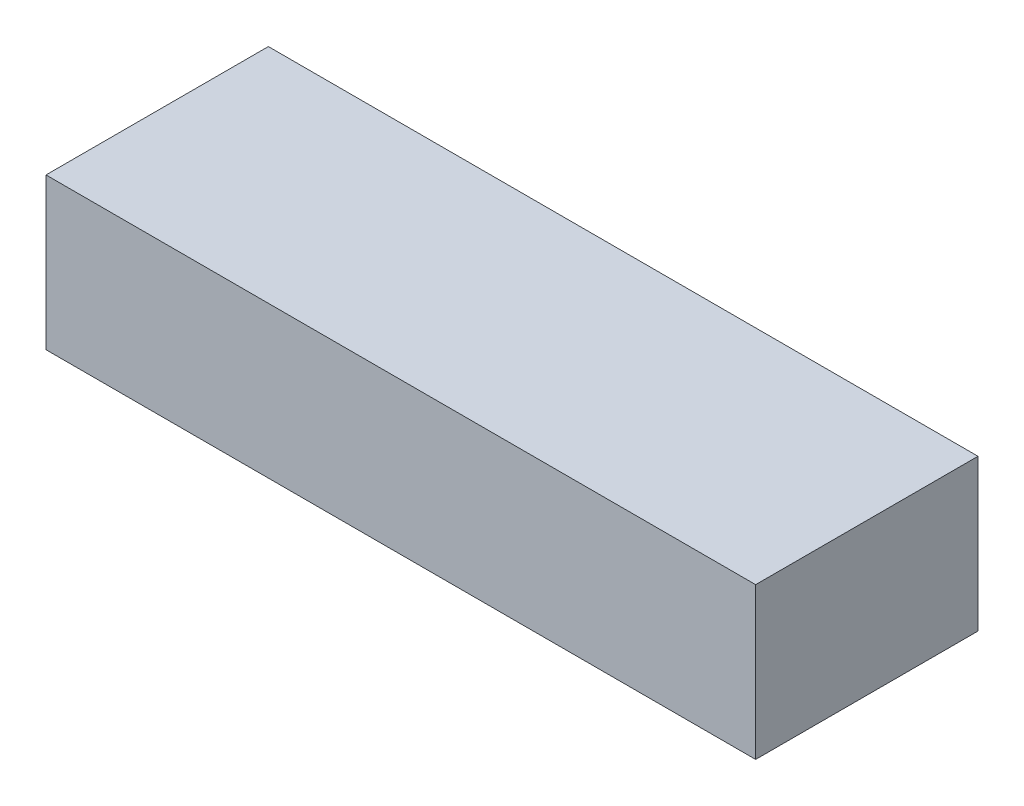
ISO-10303-21;
HEADER;
FILE_DESCRIPTION(('STEP AP214'),'2;1');
FILE_NAME('part.step','',(''),(''),'','','');
FILE_SCHEMA(('AUTOMOTIVE_DESIGN { 1 0 10303 214 1 1 1 1 }'));
ENDSEC;
DATA;
#1=APPLICATION_CONTEXT('core data for automotive mechanical design processes');
#2=APPLICATION_PROTOCOL_DEFINITION('international standard','automotive_design',2000,#1);
#3=PRODUCT_CONTEXT('',#1,'mechanical');
#4=PRODUCT('Part','Part','',(#3));
#5=PRODUCT_RELATED_PRODUCT_CATEGORY('part','',(#4));
#6=PRODUCT_DEFINITION_FORMATION('','',#4);
#7=PRODUCT_DEFINITION_CONTEXT('part definition',#1,'design');
#8=PRODUCT_DEFINITION('design','',#6,#7);
#9=PRODUCT_DEFINITION_SHAPE('','',#8);
#10=(LENGTH_UNIT() NAMED_UNIT(*) SI_UNIT(.MILLI.,.METRE.));
#11=(NAMED_UNIT(*) PLANE_ANGLE_UNIT() SI_UNIT($,.RADIAN.));
#12=(NAMED_UNIT(*) SI_UNIT($,.STERADIAN.) SOLID_ANGLE_UNIT());
#13=UNCERTAINTY_MEASURE_WITH_UNIT(LENGTH_MEASURE(1.E-05),#10,'distance_accuracy_value','');
#14=(GEOMETRIC_REPRESENTATION_CONTEXT(3) GLOBAL_UNCERTAINTY_ASSIGNED_CONTEXT((#13)) GLOBAL_UNIT_ASSIGNED_CONTEXT((#10,
#11,#12)) REPRESENTATION_CONTEXT('',''));
#15=CARTESIAN_POINT('',(0.,0.,0.));
#16=DIRECTION('',(0.,0.,1.));
#17=DIRECTION('',(1.,0.,0.));
#18=AXIS2_PLACEMENT_3D('',#15,#16,#17);
#19=CARTESIAN_POINT('',(0.,32.,0.));
#20=DIRECTION('',(1.,0.,0.));
#21=DIRECTION('',(0.,0.,-1.));
#22=AXIS2_PLACEMENT_3D('',#19,#20,#21);
#23=PLANE('',#22);
#24=DIRECTION('',(0.,0.,1.));
#25=VECTOR('',#24,1.);
#26=CARTESIAN_POINT('',(0.,0.,0.));
#27=LINE('',#26,#25);
#28=CARTESIAN_POINT('',(0.,0.,-47.));
#29=VERTEX_POINT('',#28);
#30=CARTESIAN_POINT('',(0.,0.,0.));
#31=VERTEX_POINT('',#30);
#32=EDGE_CURVE('E97',#29,#31,#27,.T.);
#33=ORIENTED_EDGE('',*,*,#32,.T.);
#34=DIRECTION('',(0.,-1.,0.));
#35=VECTOR('',#34,1.);
#36=CARTESIAN_POINT('',(0.,32.,0.));
#37=LINE('',#36,#35);
#38=CARTESIAN_POINT('',(0.,32.,0.));
#39=VERTEX_POINT('',#38);
#40=EDGE_CURVE('E11',#39,#31,#37,.T.);
#41=ORIENTED_EDGE('',*,*,#40,.F.);
#42=DIRECTION('',(0.,0.,1.));
#43=VECTOR('',#42,1.);
#44=CARTESIAN_POINT('',(0.,32.,0.));
#45=LINE('',#44,#43);
#46=CARTESIAN_POINT('',(0.,32.,-47.));
#47=VERTEX_POINT('',#46);
#48=EDGE_CURVE('E85',#47,#39,#45,.T.);
#49=ORIENTED_EDGE('',*,*,#48,.F.);
#50=DIRECTION('',(0.,-1.,0.));
#51=VECTOR('',#50,1.);
#52=CARTESIAN_POINT('',(0.,32.,-47.));
#53=LINE('',#52,#51);
#54=EDGE_CURVE('E93',#47,#29,#53,.T.);
#55=ORIENTED_EDGE('',*,*,#54,.T.);
#56=EDGE_LOOP('',(#33,#41,#49,#55));
#57=FACE_BOUND('',#56,.T.);
#58=ADVANCED_FACE('F34',(#57),#23,.F.);
#59=CARTESIAN_POINT('',(0.,32.,0.));
#60=DIRECTION('',(0.,0.,-1.));
#61=DIRECTION('',(-1.,0.,0.));
#62=AXIS2_PLACEMENT_3D('',#59,#60,#61);
#63=PLANE('',#62);
#64=DIRECTION('',(1.,0.,0.));
#65=VECTOR('',#64,1.);
#66=CARTESIAN_POINT('',(0.,0.,0.));
#67=LINE('',#66,#65);
#68=CARTESIAN_POINT('',(150.,0.,0.));
#69=VERTEX_POINT('',#68);
#70=EDGE_CURVE('E89',#31,#69,#67,.T.);
#71=ORIENTED_EDGE('',*,*,#70,.T.);
#72=DIRECTION('',(0.,-1.,0.));
#73=VECTOR('',#72,1.);
#74=CARTESIAN_POINT('',(150.,32.,0.));
#75=LINE('',#74,#73);
#76=CARTESIAN_POINT('',(150.,32.,0.));
#77=VERTEX_POINT('',#76);
#78=EDGE_CURVE('E42',#77,#69,#75,.T.);
#79=ORIENTED_EDGE('',*,*,#78,.F.);
#80=DIRECTION('',(1.,0.,0.));
#81=VECTOR('',#80,1.);
#82=CARTESIAN_POINT('',(0.,32.,0.));
#83=LINE('',#82,#81);
#84=EDGE_CURVE('E80',#39,#77,#83,.T.);
#85=ORIENTED_EDGE('',*,*,#84,.F.);
#86=ORIENTED_EDGE('',*,*,#40,.T.);
#87=EDGE_LOOP('',(#71,#79,#85,#86));
#88=FACE_BOUND('',#87,.T.);
#89=ADVANCED_FACE('F88',(#88),#63,.F.);
#90=CARTESIAN_POINT('',(150.,32.,0.));
#91=DIRECTION('',(-1.,0.,0.));
#92=DIRECTION('',(0.,0.,1.));
#93=AXIS2_PLACEMENT_3D('',#90,#91,#92);
#94=PLANE('',#93);
#95=DIRECTION('',(0.,0.,-1.));
#96=VECTOR('',#95,1.);
#97=CARTESIAN_POINT('',(150.,0.,0.));
#98=LINE('',#97,#96);
#99=CARTESIAN_POINT('',(150.,0.,-47.));
#100=VERTEX_POINT('',#99);
#101=EDGE_CURVE('E67',#69,#100,#98,.T.);
#102=ORIENTED_EDGE('',*,*,#101,.T.);
#103=DIRECTION('',(0.,-1.,0.));
#104=VECTOR('',#103,1.);
#105=CARTESIAN_POINT('',(150.,32.,-47.));
#106=LINE('',#105,#104);
#107=CARTESIAN_POINT('',(150.,32.,-47.));
#108=VERTEX_POINT('',#107);
#109=EDGE_CURVE('E90',#108,#100,#106,.T.);
#110=ORIENTED_EDGE('',*,*,#109,.F.);
#111=DIRECTION('',(0.,0.,-1.));
#112=VECTOR('',#111,1.);
#113=CARTESIAN_POINT('',(150.,32.,0.));
#114=LINE('',#113,#112);
#115=EDGE_CURVE('E83',#77,#108,#114,.T.);
#116=ORIENTED_EDGE('',*,*,#115,.F.);
#117=ORIENTED_EDGE('',*,*,#78,.T.);
#118=EDGE_LOOP('',(#102,#110,#116,#117));
#119=FACE_BOUND('',#118,.T.);
#120=ADVANCED_FACE('F91',(#119),#94,.F.);
#121=CARTESIAN_POINT('',(0.,32.,-47.));
#122=DIRECTION('',(0.,0.,1.));
#123=DIRECTION('',(1.,0.,0.));
#124=AXIS2_PLACEMENT_3D('',#121,#122,#123);
#125=PLANE('',#124);
#126=DIRECTION('',(-1.,0.,0.));
#127=VECTOR('',#126,1.);
#128=CARTESIAN_POINT('',(0.,0.,-47.));
#129=LINE('',#128,#127);
#130=EDGE_CURVE('E73',#100,#29,#129,.T.);
#131=ORIENTED_EDGE('',*,*,#130,.T.);
#132=ORIENTED_EDGE('',*,*,#54,.F.);
#133=DIRECTION('',(-1.,0.,0.));
#134=VECTOR('',#133,1.);
#135=CARTESIAN_POINT('',(0.,32.,-47.));
#136=LINE('',#135,#134);
#137=EDGE_CURVE('E50',#108,#47,#136,.T.);
#138=ORIENTED_EDGE('',*,*,#137,.F.);
#139=ORIENTED_EDGE('',*,*,#109,.T.);
#140=EDGE_LOOP('',(#131,#132,#138,#139));
#141=FACE_BOUND('',#140,.T.);
#142=ADVANCED_FACE('F104',(#141),#125,.F.);
#143=CARTESIAN_POINT('',(0.,32.,0.));
#144=DIRECTION('',(0.,-1.,0.));
#145=DIRECTION('',(0.,0.,-1.));
#146=AXIS2_PLACEMENT_3D('',#143,#144,#145);
#147=PLANE('',#146);
#148=ORIENTED_EDGE('',*,*,#48,.T.);
#149=ORIENTED_EDGE('',*,*,#84,.T.);
#150=ORIENTED_EDGE('',*,*,#115,.T.);
#151=ORIENTED_EDGE('',*,*,#137,.T.);
#152=EDGE_LOOP('',(#148,#149,#150,#151));
#153=FACE_BOUND('',#152,.T.);
#154=ADVANCED_FACE('F81',(#153),#147,.F.);
#155=CARTESIAN_POINT('',(0.,0.,0.));
#156=DIRECTION('',(0.,-1.,0.));
#157=DIRECTION('',(0.,0.,-1.));
#158=AXIS2_PLACEMENT_3D('',#155,#156,#157);
#159=PLANE('',#158);
#160=ORIENTED_EDGE('',*,*,#32,.F.);
#161=ORIENTED_EDGE('',*,*,#130,.F.);
#162=ORIENTED_EDGE('',*,*,#101,.F.);
#163=ORIENTED_EDGE('',*,*,#70,.F.);
#164=EDGE_LOOP('',(#160,#161,#162,#163));
#165=FACE_BOUND('',#164,.T.);
#166=ADVANCED_FACE('F107',(#165),#159,.T.);
#167=CLOSED_SHELL('',(#58,#89,#120,#142,#154,#166));
#168=MANIFOLD_SOLID_BREP('B2',#167);
#169=ADVANCED_BREP_SHAPE_REPRESENTATION('',(#18,#168),#14);
#170=SHAPE_DEFINITION_REPRESENTATION(#9,#169);
ENDSEC;
END-ISO-10303-21;
